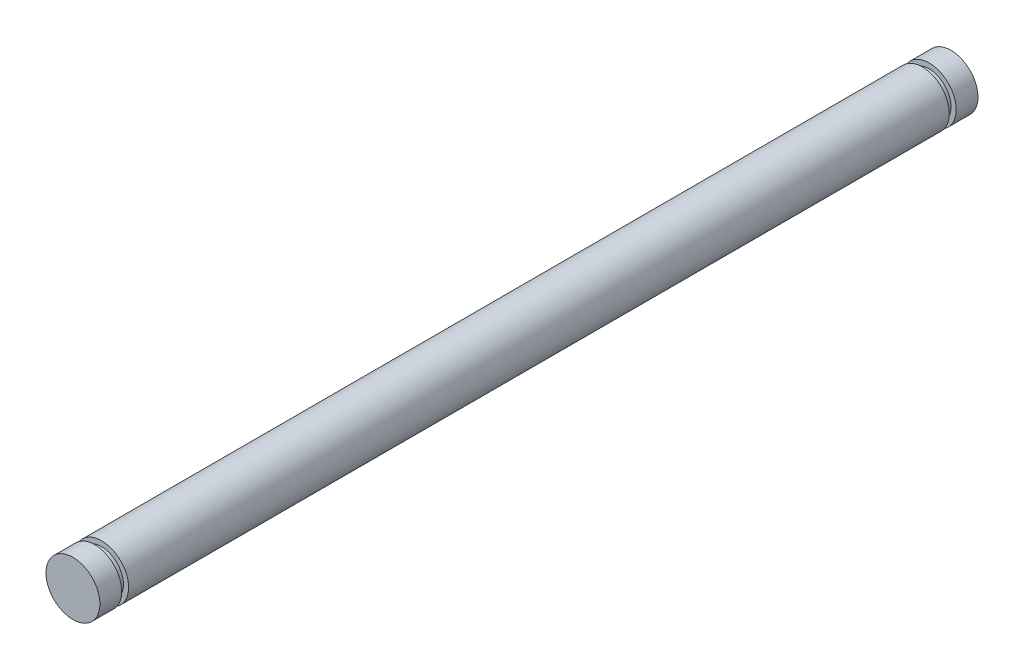
ISO-10303-21;
HEADER;
FILE_DESCRIPTION(('STEP AP214'),'2;1');
FILE_NAME('part.step','',(''),(''),'','','');
FILE_SCHEMA(('AUTOMOTIVE_DESIGN { 1 0 10303 214 1 1 1 1 }'));
ENDSEC;
DATA;
#1=APPLICATION_CONTEXT('core data for automotive mechanical design processes');
#2=APPLICATION_PROTOCOL_DEFINITION('international standard','automotive_design',2000,#1);
#3=PRODUCT_CONTEXT('',#1,'mechanical');
#4=PRODUCT('Part','Part','',(#3));
#5=PRODUCT_RELATED_PRODUCT_CATEGORY('part','',(#4));
#6=PRODUCT_DEFINITION_FORMATION('','',#4);
#7=PRODUCT_DEFINITION_CONTEXT('part definition',#1,'design');
#8=PRODUCT_DEFINITION('design','',#6,#7);
#9=PRODUCT_DEFINITION_SHAPE('','',#8);
#10=(LENGTH_UNIT() NAMED_UNIT(*) SI_UNIT(.MILLI.,.METRE.));
#11=(NAMED_UNIT(*) PLANE_ANGLE_UNIT() SI_UNIT($,.RADIAN.));
#12=(NAMED_UNIT(*) SI_UNIT($,.STERADIAN.) SOLID_ANGLE_UNIT());
#13=UNCERTAINTY_MEASURE_WITH_UNIT(LENGTH_MEASURE(1.E-05),#10,'distance_accuracy_value','');
#14=(GEOMETRIC_REPRESENTATION_CONTEXT(3) GLOBAL_UNCERTAINTY_ASSIGNED_CONTEXT((#13)) GLOBAL_UNIT_ASSIGNED_CONTEXT((#10,
#11,#12)) REPRESENTATION_CONTEXT('',''));
#15=CARTESIAN_POINT('',(0.,0.,0.));
#16=DIRECTION('',(0.,0.,1.));
#17=DIRECTION('',(1.,0.,0.));
#18=AXIS2_PLACEMENT_3D('',#15,#16,#17);
#19=CARTESIAN_POINT('',(0.,0.,32.54375));
#20=DIRECTION('',(0.,0.,-1.));
#21=DIRECTION('',(-1.,0.,0.));
#22=AXIS2_PLACEMENT_3D('',#19,#20,#21);
#23=CYLINDRICAL_SURFACE('',#22,2.);
#24=CARTESIAN_POINT('',(0.,0.,30.4165));
#25=DIRECTION('',(0.,0.,1.));
#26=DIRECTION('',(1.,0.,0.));
#27=AXIS2_PLACEMENT_3D('',#24,#25,#26);
#28=CIRCLE('',#27,2.);
#29=CARTESIAN_POINT('',(2.,0.,30.4165));
#30=VERTEX_POINT('',#29);
#31=EDGE_CURVE('E51',#30,#30,#28,.T.);
#32=ORIENTED_EDGE('',*,*,#31,.F.);
#33=EDGE_LOOP('',(#32));
#34=FACE_BOUND('',#33,.T.);
#35=CARTESIAN_POINT('',(0.,0.,-30.4165));
#36=DIRECTION('',(0.,0.,1.));
#37=DIRECTION('',(1.,0.,0.));
#38=AXIS2_PLACEMENT_3D('',#35,#36,#37);
#39=CIRCLE('',#38,2.);
#40=CARTESIAN_POINT('',(2.,0.,-30.4165));
#41=VERTEX_POINT('',#40);
#42=EDGE_CURVE('E63',#41,#41,#39,.T.);
#43=ORIENTED_EDGE('',*,*,#42,.T.);
#44=EDGE_LOOP('',(#43));
#45=FACE_BOUND('',#44,.T.);
#46=ADVANCED_FACE('F31',(#34,#45),#23,.T.);
#47=CARTESIAN_POINT('',(0.,2.,30.4165));
#48=DIRECTION('',(0.,0.,1.));
#49=DIRECTION('',(1.,0.,0.));
#50=AXIS2_PLACEMENT_3D('',#47,#48,#49);
#51=PLANE('',#50);
#52=ORIENTED_EDGE('',*,*,#31,.T.);
#53=EDGE_LOOP('',(#52));
#54=FACE_BOUND('',#53,.T.);
#55=CARTESIAN_POINT('',(0.,0.,30.4165));
#56=DIRECTION('',(0.,0.,1.));
#57=DIRECTION('',(1.,0.,0.));
#58=AXIS2_PLACEMENT_3D('',#55,#56,#57);
#59=CIRCLE('',#58,1.619);
#60=CARTESIAN_POINT('',(1.619,0.,30.4165));
#61=VERTEX_POINT('',#60);
#62=EDGE_CURVE('E41',#61,#61,#59,.T.);
#63=ORIENTED_EDGE('',*,*,#62,.F.);
#64=EDGE_LOOP('',(#63));
#65=FACE_BOUND('',#64,.T.);
#66=ADVANCED_FACE('F99',(#54,#65),#51,.T.);
#67=CARTESIAN_POINT('',(0.,0.,32.54375));
#68=DIRECTION('',(0.,0.,1.));
#69=DIRECTION('',(1.,0.,0.));
#70=AXIS2_PLACEMENT_3D('',#67,#68,#69);
#71=CYLINDRICAL_SURFACE('',#70,1.619);
#72=ORIENTED_EDGE('',*,*,#62,.T.);
#73=EDGE_LOOP('',(#72));
#74=FACE_BOUND('',#73,.T.);
#75=CARTESIAN_POINT('',(0.,0.,30.9245));
#76=DIRECTION('',(0.,0.,1.));
#77=DIRECTION('',(1.,0.,0.));
#78=AXIS2_PLACEMENT_3D('',#75,#76,#77);
#79=CIRCLE('',#78,1.619);
#80=CARTESIAN_POINT('',(1.619,0.,30.9245));
#81=VERTEX_POINT('',#80);
#82=EDGE_CURVE('E45',#81,#81,#79,.T.);
#83=ORIENTED_EDGE('',*,*,#82,.F.);
#84=EDGE_LOOP('',(#83));
#85=FACE_BOUND('',#84,.T.);
#86=ADVANCED_FACE('F104',(#74,#85),#71,.T.);
#87=CARTESIAN_POINT('',(0.,2.,30.9245));
#88=DIRECTION('',(0.,0.,-1.));
#89=DIRECTION('',(-1.,0.,0.));
#90=AXIS2_PLACEMENT_3D('',#87,#88,#89);
#91=PLANE('',#90);
#92=ORIENTED_EDGE('',*,*,#82,.T.);
#93=EDGE_LOOP('',(#92));
#94=FACE_BOUND('',#93,.T.);
#95=CARTESIAN_POINT('',(0.,0.,30.9245));
#96=DIRECTION('',(0.,0.,1.));
#97=DIRECTION('',(1.,0.,0.));
#98=AXIS2_PLACEMENT_3D('',#95,#96,#97);
#99=CIRCLE('',#98,2.);
#100=CARTESIAN_POINT('',(2.,0.,30.9245));
#101=VERTEX_POINT('',#100);
#102=EDGE_CURVE('E48',#101,#101,#99,.T.);
#103=ORIENTED_EDGE('',*,*,#102,.F.);
#104=EDGE_LOOP('',(#103));
#105=FACE_BOUND('',#104,.T.);
#106=ADVANCED_FACE('F113',(#94,#105),#91,.T.);
#107=CARTESIAN_POINT('',(0.,0.,32.54375));
#108=DIRECTION('',(0.,0.,1.));
#109=DIRECTION('',(1.,0.,0.));
#110=AXIS2_PLACEMENT_3D('',#107,#108,#109);
#111=PLANE('',#110);
#112=CARTESIAN_POINT('',(0.,0.,32.54375));
#113=DIRECTION('',(0.,0.,1.));
#114=DIRECTION('',(1.,0.,0.));
#115=AXIS2_PLACEMENT_3D('',#112,#113,#114);
#116=CIRCLE('',#115,2.);
#117=CARTESIAN_POINT('',(2.,0.,32.54375));
#118=VERTEX_POINT('',#117);
#119=EDGE_CURVE('E10',#118,#118,#116,.T.);
#120=ORIENTED_EDGE('',*,*,#119,.T.);
#121=EDGE_LOOP('',(#120));
#122=FACE_BOUND('',#121,.T.);
#123=ADVANCED_FACE('F96',(#122),#111,.T.);
#124=ORIENTED_EDGE('',*,*,#119,.F.);
#125=EDGE_LOOP('',(#124));
#126=FACE_BOUND('',#125,.T.);
#127=ORIENTED_EDGE('',*,*,#102,.T.);
#128=EDGE_LOOP('',(#127));
#129=FACE_BOUND('',#128,.T.);
#130=ADVANCED_FACE('F72',(#126,#129),#23,.T.);
#131=CARTESIAN_POINT('',(0.,2.,-30.4165));
#132=DIRECTION('',(0.,0.,-1.));
#133=DIRECTION('',(1.,0.,0.));
#134=AXIS2_PLACEMENT_3D('',#131,#132,#133);
#135=PLANE('',#134);
#136=ORIENTED_EDGE('',*,*,#42,.F.);
#137=EDGE_LOOP('',(#136));
#138=FACE_BOUND('',#137,.T.);
#139=CARTESIAN_POINT('',(0.,0.,-30.4165));
#140=DIRECTION('',(0.,0.,1.));
#141=DIRECTION('',(1.,0.,0.));
#142=AXIS2_PLACEMENT_3D('',#139,#140,#141);
#143=CIRCLE('',#142,1.619);
#144=CARTESIAN_POINT('',(1.619,0.,-30.4165));
#145=VERTEX_POINT('',#144);
#146=EDGE_CURVE('E54',#145,#145,#143,.T.);
#147=ORIENTED_EDGE('',*,*,#146,.T.);
#148=EDGE_LOOP('',(#147));
#149=FACE_BOUND('',#148,.T.);
#150=ADVANCED_FACE('F68',(#138,#149),#135,.T.);
#151=CARTESIAN_POINT('',(0.,0.,-32.54375));
#152=DIRECTION('',(0.,0.,-1.));
#153=DIRECTION('',(1.,0.,0.));
#154=AXIS2_PLACEMENT_3D('',#151,#152,#153);
#155=CYLINDRICAL_SURFACE('',#154,1.619);
#156=ORIENTED_EDGE('',*,*,#146,.F.);
#157=EDGE_LOOP('',(#156));
#158=FACE_BOUND('',#157,.T.);
#159=CARTESIAN_POINT('',(0.,0.,-30.9245));
#160=DIRECTION('',(0.,0.,1.));
#161=DIRECTION('',(1.,0.,0.));
#162=AXIS2_PLACEMENT_3D('',#159,#160,#161);
#163=CIRCLE('',#162,1.619);
#164=CARTESIAN_POINT('',(1.619,0.,-30.9245));
#165=VERTEX_POINT('',#164);
#166=EDGE_CURVE('E57',#165,#165,#163,.T.);
#167=ORIENTED_EDGE('',*,*,#166,.T.);
#168=EDGE_LOOP('',(#167));
#169=FACE_BOUND('',#168,.T.);
#170=ADVANCED_FACE('F71',(#158,#169),#155,.T.);
#171=CARTESIAN_POINT('',(0.,2.,-30.9245));
#172=DIRECTION('',(0.,0.,1.));
#173=DIRECTION('',(-1.,0.,0.));
#174=AXIS2_PLACEMENT_3D('',#171,#172,#173);
#175=PLANE('',#174);
#176=ORIENTED_EDGE('',*,*,#166,.F.);
#177=EDGE_LOOP('',(#176));
#178=FACE_BOUND('',#177,.T.);
#179=CARTESIAN_POINT('',(0.,0.,-30.9245));
#180=DIRECTION('',(0.,0.,1.));
#181=DIRECTION('',(1.,0.,0.));
#182=AXIS2_PLACEMENT_3D('',#179,#180,#181);
#183=CIRCLE('',#182,2.);
#184=CARTESIAN_POINT('',(2.,0.,-30.9245));
#185=VERTEX_POINT('',#184);
#186=EDGE_CURVE('E60',#185,#185,#183,.T.);
#187=ORIENTED_EDGE('',*,*,#186,.T.);
#188=EDGE_LOOP('',(#187));
#189=FACE_BOUND('',#188,.T.);
#190=ADVANCED_FACE('F78',(#178,#189),#175,.T.);
#191=CARTESIAN_POINT('',(0.,0.,-32.54375));
#192=DIRECTION('',(0.,0.,1.));
#193=DIRECTION('',(1.,0.,0.));
#194=AXIS2_PLACEMENT_3D('',#191,#192,#193);
#195=PLANE('',#194);
#196=CARTESIAN_POINT('',(0.,0.,-32.54375));
#197=DIRECTION('',(0.,0.,1.));
#198=DIRECTION('',(1.,0.,0.));
#199=AXIS2_PLACEMENT_3D('',#196,#197,#198);
#200=CIRCLE('',#199,2.);
#201=CARTESIAN_POINT('',(2.,0.,-32.54375));
#202=VERTEX_POINT('',#201);
#203=EDGE_CURVE('E34',#202,#202,#200,.T.);
#204=ORIENTED_EDGE('',*,*,#203,.F.);
#205=EDGE_LOOP('',(#204));
#206=FACE_BOUND('',#205,.T.);
#207=ADVANCED_FACE('F84',(#206),#195,.F.);
#208=ORIENTED_EDGE('',*,*,#203,.T.);
#209=EDGE_LOOP('',(#208));
#210=FACE_BOUND('',#209,.T.);
#211=ORIENTED_EDGE('',*,*,#186,.F.);
#212=EDGE_LOOP('',(#211));
#213=FACE_BOUND('',#212,.T.);
#214=ADVANCED_FACE('F88',(#210,#213),#23,.T.);
#215=CLOSED_SHELL('',(#46,#66,#86,#106,#123,#130,#150,#170,#190,#207,#214));
#216=MANIFOLD_SOLID_BREP('B2',#215);
#217=ADVANCED_BREP_SHAPE_REPRESENTATION('',(#18,#216),#14);
#218=SHAPE_DEFINITION_REPRESENTATION(#9,#217);
ENDSEC;
END-ISO-10303-21;
